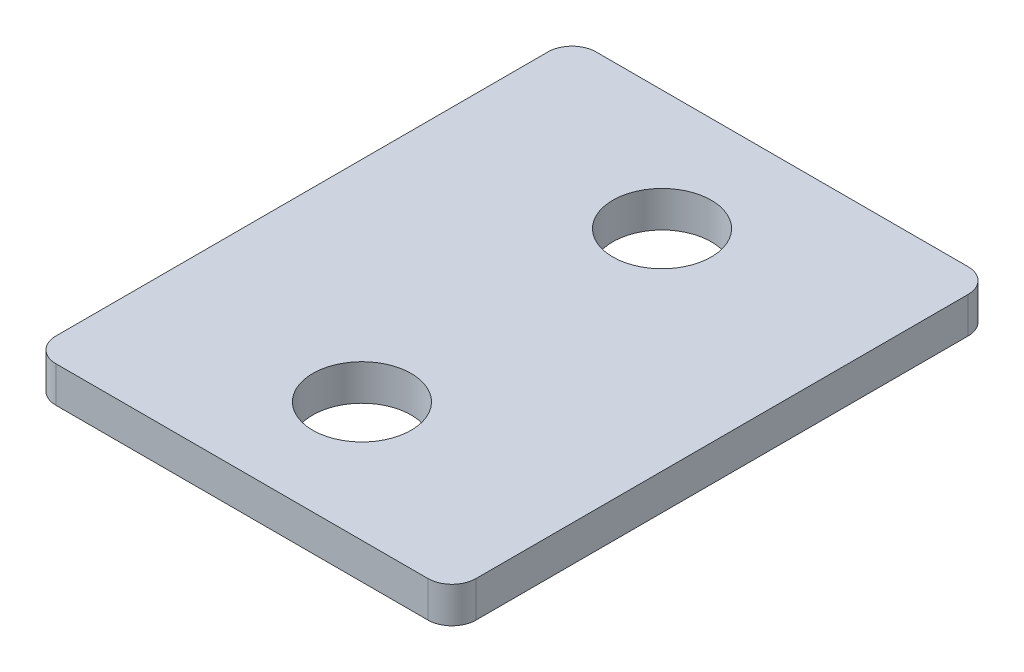
ISO-10303-21;
HEADER;
FILE_DESCRIPTION(('STEP AP214'),'2;1');
FILE_NAME('part.step','',(''),(''),'','','');
FILE_SCHEMA(('AUTOMOTIVE_DESIGN { 1 0 10303 214 1 1 1 1 }'));
ENDSEC;
DATA;
#1=APPLICATION_CONTEXT('core data for automotive mechanical design processes');
#2=APPLICATION_PROTOCOL_DEFINITION('international standard','automotive_design',2000,#1);
#3=PRODUCT_CONTEXT('',#1,'mechanical');
#4=PRODUCT('Part','Part','',(#3));
#5=PRODUCT_RELATED_PRODUCT_CATEGORY('part','',(#4));
#6=PRODUCT_DEFINITION_FORMATION('','',#4);
#7=PRODUCT_DEFINITION_CONTEXT('part definition',#1,'design');
#8=PRODUCT_DEFINITION('design','',#6,#7);
#9=PRODUCT_DEFINITION_SHAPE('','',#8);
#10=(LENGTH_UNIT() NAMED_UNIT(*) SI_UNIT(.MILLI.,.METRE.));
#11=(NAMED_UNIT(*) PLANE_ANGLE_UNIT() SI_UNIT($,.RADIAN.));
#12=(NAMED_UNIT(*) SI_UNIT($,.STERADIAN.) SOLID_ANGLE_UNIT());
#13=UNCERTAINTY_MEASURE_WITH_UNIT(LENGTH_MEASURE(1.E-05),#10,'distance_accuracy_value','');
#14=(GEOMETRIC_REPRESENTATION_CONTEXT(3) GLOBAL_UNCERTAINTY_ASSIGNED_CONTEXT((#13)) GLOBAL_UNIT_ASSIGNED_CONTEXT((#10,
#11,#12)) REPRESENTATION_CONTEXT('',''));
#15=CARTESIAN_POINT('',(0.,0.,0.));
#16=DIRECTION('',(0.,0.,1.));
#17=DIRECTION('',(1.,0.,0.));
#18=AXIS2_PLACEMENT_3D('',#15,#16,#17);
#19=CARTESIAN_POINT('',(-15.5,3.,20.5));
#20=DIRECTION('',(0.,1.,0.));
#21=DIRECTION('',(0.,0.,1.));
#22=AXIS2_PLACEMENT_3D('',#19,#20,#21);
#23=PLANE('',#22);
#24=CARTESIAN_POINT('',(0.,3.,-12.5));
#25=DIRECTION('',(0.,1.,0.));
#26=DIRECTION('',(0.,0.,1.));
#27=AXIS2_PLACEMENT_3D('',#24,#25,#26);
#28=CIRCLE('',#27,4.1);
#29=CARTESIAN_POINT('',(0.,3.,-8.4));
#30=VERTEX_POINT('',#29);
#31=EDGE_CURVE('E146',#30,#30,#28,.T.);
#32=ORIENTED_EDGE('',*,*,#31,.F.);
#33=EDGE_LOOP('',(#32));
#34=FACE_BOUND('',#33,.T.);
#35=CARTESIAN_POINT('',(-15.5,3.,20.5));
#36=DIRECTION('',(0.,1.,0.));
#37=DIRECTION('',(0.,0.,1.));
#38=AXIS2_PLACEMENT_3D('',#35,#36,#37);
#39=CIRCLE('',#38,2.);
#40=CARTESIAN_POINT('',(-17.5,3.,20.5));
#41=VERTEX_POINT('',#40);
#42=CARTESIAN_POINT('',(-15.5,3.,22.5));
#43=VERTEX_POINT('',#42);
#44=EDGE_CURVE('E164',#41,#43,#39,.T.);
#45=ORIENTED_EDGE('',*,*,#44,.T.);
#46=DIRECTION('',(1.,0.,0.));
#47=VECTOR('',#46,1.);
#48=CARTESIAN_POINT('',(-15.5,3.,22.5));
#49=LINE('',#48,#47);
#50=CARTESIAN_POINT('',(15.5,3.,22.5));
#51=VERTEX_POINT('',#50);
#52=EDGE_CURVE('E100',#43,#51,#49,.T.);
#53=ORIENTED_EDGE('',*,*,#52,.T.);
#54=CARTESIAN_POINT('',(15.5,3.,20.5));
#55=DIRECTION('',(0.,1.,0.));
#56=DIRECTION('',(0.,0.,-1.));
#57=AXIS2_PLACEMENT_3D('',#54,#55,#56);
#58=CIRCLE('',#57,2.);
#59=CARTESIAN_POINT('',(17.5,3.,20.5));
#60=VERTEX_POINT('',#59);
#61=EDGE_CURVE('E185',#51,#60,#58,.T.);
#62=ORIENTED_EDGE('',*,*,#61,.T.);
#63=DIRECTION('',(0.,0.,-1.));
#64=VECTOR('',#63,1.);
#65=CARTESIAN_POINT('',(17.5,3.,20.5));
#66=LINE('',#65,#64);
#67=CARTESIAN_POINT('',(17.5,3.,-20.5));
#68=VERTEX_POINT('',#67);
#69=EDGE_CURVE('E199',#60,#68,#66,.T.);
#70=ORIENTED_EDGE('',*,*,#69,.T.);
#71=CARTESIAN_POINT('',(15.5,3.,-20.5));
#72=DIRECTION('',(0.,1.,0.));
#73=DIRECTION('',(0.,0.,-1.));
#74=AXIS2_PLACEMENT_3D('',#71,#72,#73);
#75=CIRCLE('',#74,2.);
#76=CARTESIAN_POINT('',(15.5,3.,-22.5));
#77=VERTEX_POINT('',#76);
#78=EDGE_CURVE('E119',#68,#77,#75,.T.);
#79=ORIENTED_EDGE('',*,*,#78,.T.);
#80=DIRECTION('',(-1.,0.,0.));
#81=VECTOR('',#80,1.);
#82=CARTESIAN_POINT('',(-15.5,3.,-22.5));
#83=LINE('',#82,#81);
#84=CARTESIAN_POINT('',(-15.5,3.,-22.5));
#85=VERTEX_POINT('',#84);
#86=EDGE_CURVE('E113',#77,#85,#83,.T.);
#87=ORIENTED_EDGE('',*,*,#86,.T.);
#88=CARTESIAN_POINT('',(-15.5,3.,-20.5));
#89=DIRECTION('',(0.,1.,0.));
#90=DIRECTION('',(0.,0.,1.));
#91=AXIS2_PLACEMENT_3D('',#88,#89,#90);
#92=CIRCLE('',#91,2.);
#93=CARTESIAN_POINT('',(-17.5,3.,-20.5));
#94=VERTEX_POINT('',#93);
#95=EDGE_CURVE('E117',#85,#94,#92,.T.);
#96=ORIENTED_EDGE('',*,*,#95,.T.);
#97=DIRECTION('',(0.,0.,1.));
#98=VECTOR('',#97,1.);
#99=CARTESIAN_POINT('',(-17.5,3.,20.5));
#100=LINE('',#99,#98);
#101=EDGE_CURVE('E57',#94,#41,#100,.T.);
#102=ORIENTED_EDGE('',*,*,#101,.T.);
#103=EDGE_LOOP('',(#45,#53,#62,#70,#79,#87,#96,#102));
#104=FACE_BOUND('',#103,.T.);
#105=CARTESIAN_POINT('',(0.,3.,12.5));
#106=DIRECTION('',(0.,1.,0.));
#107=DIRECTION('',(0.,0.,1.));
#108=AXIS2_PLACEMENT_3D('',#105,#106,#107);
#109=CIRCLE('',#108,4.1);
#110=CARTESIAN_POINT('',(0.,3.,16.6));
#111=VERTEX_POINT('',#110);
#112=EDGE_CURVE('E213',#111,#111,#109,.T.);
#113=ORIENTED_EDGE('',*,*,#112,.F.);
#114=EDGE_LOOP('',(#113));
#115=FACE_BOUND('',#114,.T.);
#116=ADVANCED_FACE('F39',(#34,#104,#115),#23,.T.);
#117=CARTESIAN_POINT('',(-15.5,0.,20.5));
#118=DIRECTION('',(0.,1.,0.));
#119=DIRECTION('',(0.,0.,1.));
#120=AXIS2_PLACEMENT_3D('',#117,#118,#119);
#121=PLANE('',#120);
#122=CARTESIAN_POINT('',(-15.5,0.,20.5));
#123=DIRECTION('',(0.,1.,0.));
#124=DIRECTION('',(0.,0.,1.));
#125=AXIS2_PLACEMENT_3D('',#122,#123,#124);
#126=CIRCLE('',#125,2.);
#127=CARTESIAN_POINT('',(-17.5,0.,20.5));
#128=VERTEX_POINT('',#127);
#129=CARTESIAN_POINT('',(-15.5,0.,22.5));
#130=VERTEX_POINT('',#129);
#131=EDGE_CURVE('E141',#128,#130,#126,.T.);
#132=ORIENTED_EDGE('',*,*,#131,.F.);
#133=DIRECTION('',(0.,0.,1.));
#134=VECTOR('',#133,1.);
#135=CARTESIAN_POINT('',(-17.5,0.,20.5));
#136=LINE('',#135,#134);
#137=CARTESIAN_POINT('',(-17.5,0.,-20.5));
#138=VERTEX_POINT('',#137);
#139=EDGE_CURVE('E92',#138,#128,#136,.T.);
#140=ORIENTED_EDGE('',*,*,#139,.F.);
#141=CARTESIAN_POINT('',(-15.5,0.,-20.5));
#142=DIRECTION('',(0.,1.,0.));
#143=DIRECTION('',(0.,0.,1.));
#144=AXIS2_PLACEMENT_3D('',#141,#142,#143);
#145=CIRCLE('',#144,2.);
#146=CARTESIAN_POINT('',(-15.5,0.,-22.5));
#147=VERTEX_POINT('',#146);
#148=EDGE_CURVE('E86',#147,#138,#145,.T.);
#149=ORIENTED_EDGE('',*,*,#148,.F.);
#150=DIRECTION('',(-1.,0.,0.));
#151=VECTOR('',#150,1.);
#152=CARTESIAN_POINT('',(-15.5,0.,-22.5));
#153=LINE('',#152,#151);
#154=CARTESIAN_POINT('',(15.5,0.,-22.5));
#155=VERTEX_POINT('',#154);
#156=EDGE_CURVE('E128',#155,#147,#153,.T.);
#157=ORIENTED_EDGE('',*,*,#156,.F.);
#158=CARTESIAN_POINT('',(15.5,0.,-20.5));
#159=DIRECTION('',(0.,1.,0.));
#160=DIRECTION('',(0.,0.,-1.));
#161=AXIS2_PLACEMENT_3D('',#158,#159,#160);
#162=CIRCLE('',#161,2.);
#163=CARTESIAN_POINT('',(17.5,0.,-20.5));
#164=VERTEX_POINT('',#163);
#165=EDGE_CURVE('E155',#164,#155,#162,.T.);
#166=ORIENTED_EDGE('',*,*,#165,.F.);
#167=DIRECTION('',(0.,0.,-1.));
#168=VECTOR('',#167,1.);
#169=CARTESIAN_POINT('',(17.5,0.,20.5));
#170=LINE('',#169,#168);
#171=CARTESIAN_POINT('',(17.5,0.,20.5));
#172=VERTEX_POINT('',#171);
#173=EDGE_CURVE('E152',#172,#164,#170,.T.);
#174=ORIENTED_EDGE('',*,*,#173,.F.);
#175=CARTESIAN_POINT('',(15.5,0.,20.5));
#176=DIRECTION('',(0.,1.,0.));
#177=DIRECTION('',(0.,0.,-1.));
#178=AXIS2_PLACEMENT_3D('',#175,#176,#177);
#179=CIRCLE('',#178,2.);
#180=CARTESIAN_POINT('',(15.5,0.,22.5));
#181=VERTEX_POINT('',#180);
#182=EDGE_CURVE('E149',#181,#172,#179,.T.);
#183=ORIENTED_EDGE('',*,*,#182,.F.);
#184=DIRECTION('',(1.,0.,0.));
#185=VECTOR('',#184,1.);
#186=CARTESIAN_POINT('',(-15.5,0.,22.5));
#187=LINE('',#186,#185);
#188=EDGE_CURVE('E145',#130,#181,#187,.T.);
#189=ORIENTED_EDGE('',*,*,#188,.F.);
#190=EDGE_LOOP('',(#132,#140,#149,#157,#166,#174,#183,#189));
#191=FACE_BOUND('',#190,.T.);
#192=CARTESIAN_POINT('',(0.,0.,-12.5));
#193=DIRECTION('',(0.,1.,0.));
#194=DIRECTION('',(0.,0.,1.));
#195=AXIS2_PLACEMENT_3D('',#192,#193,#194);
#196=CIRCLE('',#195,4.1);
#197=CARTESIAN_POINT('',(0.,0.,-8.4));
#198=VERTEX_POINT('',#197);
#199=EDGE_CURVE('E209',#198,#198,#196,.T.);
#200=ORIENTED_EDGE('',*,*,#199,.T.);
#201=EDGE_LOOP('',(#200));
#202=FACE_BOUND('',#201,.T.);
#203=CARTESIAN_POINT('',(0.,0.,12.5));
#204=DIRECTION('',(0.,1.,0.));
#205=DIRECTION('',(0.,0.,1.));
#206=AXIS2_PLACEMENT_3D('',#203,#204,#205);
#207=CIRCLE('',#206,4.1);
#208=CARTESIAN_POINT('',(0.,0.,16.6));
#209=VERTEX_POINT('',#208);
#210=EDGE_CURVE('E217',#209,#209,#207,.T.);
#211=ORIENTED_EDGE('',*,*,#210,.T.);
#212=EDGE_LOOP('',(#211));
#213=FACE_BOUND('',#212,.T.);
#214=ADVANCED_FACE('F189',(#191,#202,#213),#121,.F.);
#215=CARTESIAN_POINT('',(-15.5,3.,20.5));
#216=DIRECTION('',(0.,-1.,0.));
#217=DIRECTION('',(0.,0.,-1.));
#218=AXIS2_PLACEMENT_3D('',#215,#216,#217);
#219=CYLINDRICAL_SURFACE('',#218,2.);
#220=ORIENTED_EDGE('',*,*,#131,.T.);
#221=DIRECTION('',(0.,-1.,0.));
#222=VECTOR('',#221,1.);
#223=CARTESIAN_POINT('',(-15.5,3.,22.5));
#224=LINE('',#223,#222);
#225=EDGE_CURVE('E11',#43,#130,#224,.T.);
#226=ORIENTED_EDGE('',*,*,#225,.F.);
#227=ORIENTED_EDGE('',*,*,#44,.F.);
#228=DIRECTION('',(0.,-1.,0.));
#229=VECTOR('',#228,1.);
#230=CARTESIAN_POINT('',(-17.5,3.,20.5));
#231=LINE('',#230,#229);
#232=EDGE_CURVE('E137',#41,#128,#231,.T.);
#233=ORIENTED_EDGE('',*,*,#232,.T.);
#234=EDGE_LOOP('',(#220,#226,#227,#233));
#235=FACE_BOUND('',#234,.T.);
#236=ADVANCED_FACE('F41',(#235),#219,.T.);
#237=CARTESIAN_POINT('',(-15.5,3.,22.5));
#238=DIRECTION('',(0.,0.,-1.));
#239=DIRECTION('',(-1.,0.,0.));
#240=AXIS2_PLACEMENT_3D('',#237,#238,#239);
#241=PLANE('',#240);
#242=ORIENTED_EDGE('',*,*,#188,.T.);
#243=DIRECTION('',(0.,-1.,0.));
#244=VECTOR('',#243,1.);
#245=CARTESIAN_POINT('',(15.5,3.,22.5));
#246=LINE('',#245,#244);
#247=EDGE_CURVE('E49',#51,#181,#246,.T.);
#248=ORIENTED_EDGE('',*,*,#247,.F.);
#249=ORIENTED_EDGE('',*,*,#52,.F.);
#250=ORIENTED_EDGE('',*,*,#225,.T.);
#251=EDGE_LOOP('',(#242,#248,#249,#250));
#252=FACE_BOUND('',#251,.T.);
#253=ADVANCED_FACE('F251',(#252),#241,.F.);
#254=CARTESIAN_POINT('',(15.5,3.,20.5));
#255=DIRECTION('',(0.,-1.,0.));
#256=DIRECTION('',(0.,0.,-1.));
#257=AXIS2_PLACEMENT_3D('',#254,#255,#256);
#258=CYLINDRICAL_SURFACE('',#257,2.);
#259=ORIENTED_EDGE('',*,*,#182,.T.);
#260=DIRECTION('',(0.,-1.,0.));
#261=VECTOR('',#260,1.);
#262=CARTESIAN_POINT('',(17.5,3.,20.5));
#263=LINE('',#262,#261);
#264=EDGE_CURVE('E175',#60,#172,#263,.T.);
#265=ORIENTED_EDGE('',*,*,#264,.F.);
#266=ORIENTED_EDGE('',*,*,#61,.F.);
#267=ORIENTED_EDGE('',*,*,#247,.T.);
#268=EDGE_LOOP('',(#259,#265,#266,#267));
#269=FACE_BOUND('',#268,.T.);
#270=ADVANCED_FACE('F183',(#269),#258,.T.);
#271=CARTESIAN_POINT('',(17.5,3.,20.5));
#272=DIRECTION('',(-1.,0.,0.));
#273=DIRECTION('',(0.,0.,1.));
#274=AXIS2_PLACEMENT_3D('',#271,#272,#273);
#275=PLANE('',#274);
#276=ORIENTED_EDGE('',*,*,#173,.T.);
#277=DIRECTION('',(0.,-1.,0.));
#278=VECTOR('',#277,1.);
#279=CARTESIAN_POINT('',(17.5,3.,-20.5));
#280=LINE('',#279,#278);
#281=EDGE_CURVE('E171',#68,#164,#280,.T.);
#282=ORIENTED_EDGE('',*,*,#281,.F.);
#283=ORIENTED_EDGE('',*,*,#69,.F.);
#284=ORIENTED_EDGE('',*,*,#264,.T.);
#285=EDGE_LOOP('',(#276,#282,#283,#284));
#286=FACE_BOUND('',#285,.T.);
#287=ADVANCED_FACE('F194',(#286),#275,.F.);
#288=CARTESIAN_POINT('',(15.5,3.,-20.5));
#289=DIRECTION('',(0.,-1.,0.));
#290=DIRECTION('',(0.,0.,-1.));
#291=AXIS2_PLACEMENT_3D('',#288,#289,#290);
#292=CYLINDRICAL_SURFACE('',#291,2.);
#293=ORIENTED_EDGE('',*,*,#165,.T.);
#294=DIRECTION('',(0.,-1.,0.));
#295=VECTOR('',#294,1.);
#296=CARTESIAN_POINT('',(15.5,3.,-22.5));
#297=LINE('',#296,#295);
#298=EDGE_CURVE('E130',#77,#155,#297,.T.);
#299=ORIENTED_EDGE('',*,*,#298,.F.);
#300=ORIENTED_EDGE('',*,*,#78,.F.);
#301=ORIENTED_EDGE('',*,*,#281,.T.);
#302=EDGE_LOOP('',(#293,#299,#300,#301));
#303=FACE_BOUND('',#302,.T.);
#304=ADVANCED_FACE('F197',(#303),#292,.T.);
#305=CARTESIAN_POINT('',(-15.5,3.,-22.5));
#306=DIRECTION('',(0.,0.,1.));
#307=DIRECTION('',(1.,0.,0.));
#308=AXIS2_PLACEMENT_3D('',#305,#306,#307);
#309=PLANE('',#308);
#310=ORIENTED_EDGE('',*,*,#156,.T.);
#311=DIRECTION('',(0.,-1.,0.));
#312=VECTOR('',#311,1.);
#313=CARTESIAN_POINT('',(-15.5,3.,-22.5));
#314=LINE('',#313,#312);
#315=EDGE_CURVE('E125',#85,#147,#314,.T.);
#316=ORIENTED_EDGE('',*,*,#315,.F.);
#317=ORIENTED_EDGE('',*,*,#86,.F.);
#318=ORIENTED_EDGE('',*,*,#298,.T.);
#319=EDGE_LOOP('',(#310,#316,#317,#318));
#320=FACE_BOUND('',#319,.T.);
#321=ADVANCED_FACE('F126',(#320),#309,.F.);
#322=CARTESIAN_POINT('',(-15.5,3.,-20.5));
#323=DIRECTION('',(0.,-1.,0.));
#324=DIRECTION('',(0.,0.,-1.));
#325=AXIS2_PLACEMENT_3D('',#322,#323,#324);
#326=CYLINDRICAL_SURFACE('',#325,2.);
#327=ORIENTED_EDGE('',*,*,#148,.T.);
#328=DIRECTION('',(0.,-1.,0.));
#329=VECTOR('',#328,1.);
#330=CARTESIAN_POINT('',(-17.5,3.,-20.5));
#331=LINE('',#330,#329);
#332=EDGE_CURVE('E131',#94,#138,#331,.T.);
#333=ORIENTED_EDGE('',*,*,#332,.F.);
#334=ORIENTED_EDGE('',*,*,#95,.F.);
#335=ORIENTED_EDGE('',*,*,#315,.T.);
#336=EDGE_LOOP('',(#327,#333,#334,#335));
#337=FACE_BOUND('',#336,.T.);
#338=ADVANCED_FACE('F133',(#337),#326,.T.);
#339=CARTESIAN_POINT('',(-17.5,3.,20.5));
#340=DIRECTION('',(1.,0.,0.));
#341=DIRECTION('',(0.,0.,-1.));
#342=AXIS2_PLACEMENT_3D('',#339,#340,#341);
#343=PLANE('',#342);
#344=ORIENTED_EDGE('',*,*,#139,.T.);
#345=ORIENTED_EDGE('',*,*,#232,.F.);
#346=ORIENTED_EDGE('',*,*,#101,.F.);
#347=ORIENTED_EDGE('',*,*,#332,.T.);
#348=EDGE_LOOP('',(#344,#345,#346,#347));
#349=FACE_BOUND('',#348,.T.);
#350=ADVANCED_FACE('F239',(#349),#343,.F.);
#351=CARTESIAN_POINT('',(0.,3.,-12.5));
#352=DIRECTION('',(0.,-1.,0.));
#353=DIRECTION('',(0.,0.,-1.));
#354=AXIS2_PLACEMENT_3D('',#351,#352,#353);
#355=CYLINDRICAL_SURFACE('',#354,4.1);
#356=ORIENTED_EDGE('',*,*,#31,.T.);
#357=EDGE_LOOP('',(#356));
#358=FACE_BOUND('',#357,.T.);
#359=ORIENTED_EDGE('',*,*,#199,.F.);
#360=EDGE_LOOP('',(#359));
#361=FACE_BOUND('',#360,.T.);
#362=ADVANCED_FACE('F236',(#358,#361),#355,.F.);
#363=CARTESIAN_POINT('',(0.,3.,12.5));
#364=DIRECTION('',(0.,-1.,0.));
#365=DIRECTION('',(0.,0.,-1.));
#366=AXIS2_PLACEMENT_3D('',#363,#364,#365);
#367=CYLINDRICAL_SURFACE('',#366,4.1);
#368=ORIENTED_EDGE('',*,*,#112,.T.);
#369=EDGE_LOOP('',(#368));
#370=FACE_BOUND('',#369,.T.);
#371=ORIENTED_EDGE('',*,*,#210,.F.);
#372=EDGE_LOOP('',(#371));
#373=FACE_BOUND('',#372,.T.);
#374=ADVANCED_FACE('F225',(#370,#373),#367,.F.);
#375=CLOSED_SHELL('',(#116,#214,#236,#253,#270,#287,#304,#321,#338,#350,#362,#374));
#376=MANIFOLD_SOLID_BREP('B2',#375);
#377=ADVANCED_BREP_SHAPE_REPRESENTATION('',(#18,#376),#14);
#378=SHAPE_DEFINITION_REPRESENTATION(#9,#377);
ENDSEC;
END-ISO-10303-21;
